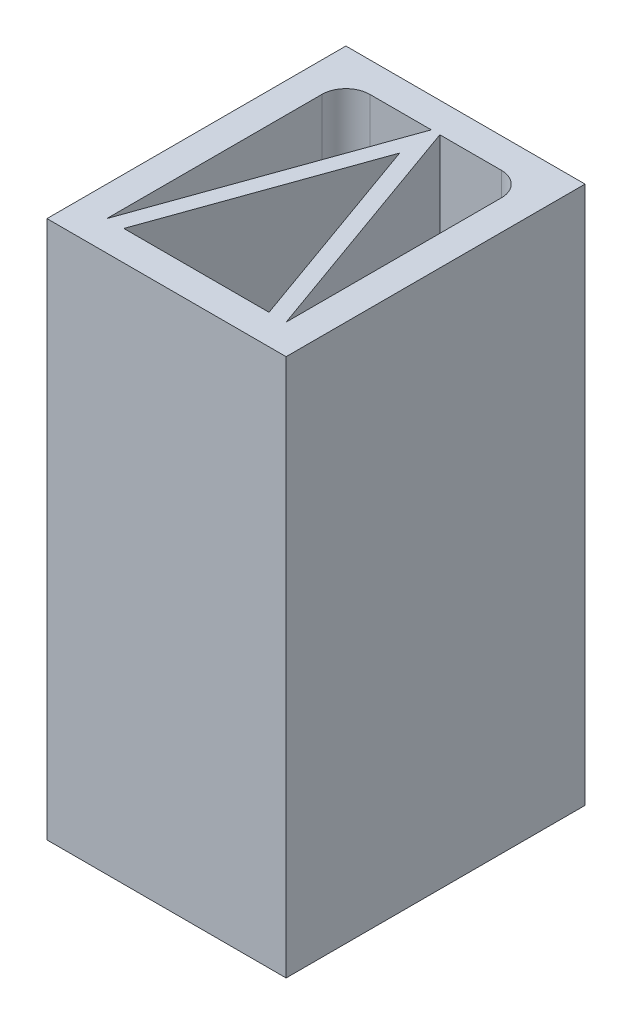
ISO-10303-21;
HEADER;
FILE_DESCRIPTION(('STEP AP214'),'2;1');
FILE_NAME('part.step','',(''),(''),'','','');
FILE_SCHEMA(('AUTOMOTIVE_DESIGN { 1 0 10303 214 1 1 1 1 }'));
ENDSEC;
DATA;
#1=APPLICATION_CONTEXT('core data for automotive mechanical design processes');
#2=APPLICATION_PROTOCOL_DEFINITION('international standard','automotive_design',2000,#1);
#3=PRODUCT_CONTEXT('',#1,'mechanical');
#4=PRODUCT('Part','Part','',(#3));
#5=PRODUCT_RELATED_PRODUCT_CATEGORY('part','',(#4));
#6=PRODUCT_DEFINITION_FORMATION('','',#4);
#7=PRODUCT_DEFINITION_CONTEXT('part definition',#1,'design');
#8=PRODUCT_DEFINITION('design','',#6,#7);
#9=PRODUCT_DEFINITION_SHAPE('','',#8);
#10=(LENGTH_UNIT() NAMED_UNIT(*) SI_UNIT(.MILLI.,.METRE.));
#11=(NAMED_UNIT(*) PLANE_ANGLE_UNIT() SI_UNIT($,.RADIAN.));
#12=(NAMED_UNIT(*) SI_UNIT($,.STERADIAN.) SOLID_ANGLE_UNIT());
#13=UNCERTAINTY_MEASURE_WITH_UNIT(LENGTH_MEASURE(1.E-05),#10,'distance_accuracy_value','');
#14=(GEOMETRIC_REPRESENTATION_CONTEXT(3) GLOBAL_UNCERTAINTY_ASSIGNED_CONTEXT((#13)) GLOBAL_UNIT_ASSIGNED_CONTEXT((#10,
#11,#12)) REPRESENTATION_CONTEXT('',''));
#15=CARTESIAN_POINT('',(0.,0.,0.));
#16=DIRECTION('',(0.,0.,1.));
#17=DIRECTION('',(1.,0.,0.));
#18=AXIS2_PLACEMENT_3D('',#15,#16,#17);
#19=CARTESIAN_POINT('',(2.5,45.,-22.5));
#20=DIRECTION('',(0.,0.,1.));
#21=DIRECTION('',(1.,0.,0.));
#22=AXIS2_PLACEMENT_3D('',#19,#20,#21);
#23=PLANE('',#22);
#24=DIRECTION('',(-1.,0.,0.));
#25=VECTOR('',#24,1.);
#26=CARTESIAN_POINT('',(2.5,0.,-22.5));
#27=LINE('',#26,#25);
#28=CARTESIAN_POINT('',(15.5,0.,-22.5));
#29=VERTEX_POINT('',#28);
#30=CARTESIAN_POINT('',(10.3571428571429,0.,-22.5));
#31=VERTEX_POINT('',#30);
#32=EDGE_CURVE('E202',#29,#31,#27,.T.);
#33=ORIENTED_EDGE('',*,*,#32,.F.);
#34=DIRECTION('',(0.,-1.,0.));
#35=VECTOR('',#34,1.);
#36=CARTESIAN_POINT('',(15.5,45.,-22.5));
#37=LINE('',#36,#35);
#38=CARTESIAN_POINT('',(15.5,45.,-22.5));
#39=VERTEX_POINT('',#38);
#40=EDGE_CURVE('E57',#29,#39,#37,.F.);
#41=ORIENTED_EDGE('',*,*,#40,.T.);
#42=DIRECTION('',(-1.,0.,0.));
#43=VECTOR('',#42,1.);
#44=CARTESIAN_POINT('',(2.5,45.,-22.5));
#45=LINE('',#44,#43);
#46=CARTESIAN_POINT('',(10.3571428571429,45.,-22.5));
#47=VERTEX_POINT('',#46);
#48=EDGE_CURVE('E210',#39,#47,#45,.T.);
#49=ORIENTED_EDGE('',*,*,#48,.T.);
#50=DIRECTION('',(0.,1.,0.));
#51=VECTOR('',#50,1.);
#52=CARTESIAN_POINT('',(10.3571428571429,45.,-22.5));
#53=LINE('',#52,#51);
#54=EDGE_CURVE('E279',#31,#47,#53,.T.);
#55=ORIENTED_EDGE('',*,*,#54,.F.);
#56=EDGE_LOOP('',(#33,#41,#49,#55));
#57=FACE_BOUND('',#56,.T.);
#58=ADVANCED_FACE('F41',(#57),#23,.T.);
#59=CARTESIAN_POINT('',(0.,45.,0.));
#60=DIRECTION('',(0.,-1.,0.));
#61=DIRECTION('',(0.,0.,-1.));
#62=AXIS2_PLACEMENT_3D('',#59,#60,#61);
#63=PLANE('',#62);
#64=DIRECTION('',(0.336336396998156,0.,0.941741911594837));
#65=VECTOR('',#64,1.);
#66=CARTESIAN_POINT('',(17.5,45.,-2.5));
#67=LINE('',#66,#65);
#68=CARTESIAN_POINT('',(17.5,45.,-2.5));
#69=VERTEX_POINT('',#68);
#70=EDGE_CURVE('E183',#47,#69,#67,.T.);
#71=ORIENTED_EDGE('',*,*,#70,.F.);
#72=ORIENTED_EDGE('',*,*,#48,.F.);
#73=CARTESIAN_POINT('',(15.5,45.,-20.5));
#74=DIRECTION('',(0.,-1.,0.));
#75=DIRECTION('',(0.,0.,-1.));
#76=AXIS2_PLACEMENT_3D('',#73,#74,#75);
#77=CIRCLE('',#76,2.);
#78=CARTESIAN_POINT('',(17.5,45.,-20.5));
#79=VERTEX_POINT('',#78);
#80=EDGE_CURVE('E11',#39,#79,#77,.T.);
#81=ORIENTED_EDGE('',*,*,#80,.T.);
#82=DIRECTION('',(0.,0.,-1.));
#83=VECTOR('',#82,1.);
#84=CARTESIAN_POINT('',(17.5,45.,-22.5));
#85=LINE('',#84,#83);
#86=EDGE_CURVE('E205',#69,#79,#85,.T.);
#87=ORIENTED_EDGE('',*,*,#86,.F.);
#88=EDGE_LOOP('',(#71,#72,#81,#87));
#89=FACE_BOUND('',#88,.T.);
#90=DIRECTION('',(-0.336336396998156,0.,-0.941741911594838));
#91=VECTOR('',#90,1.);
#92=CARTESIAN_POINT('',(16.0714285714286,45.,-2.5));
#93=LINE('',#92,#91);
#94=CARTESIAN_POINT('',(16.0714285714286,45.,-2.5));
#95=VERTEX_POINT('',#94);
#96=CARTESIAN_POINT('',(10.,45.,-19.5));
#97=VERTEX_POINT('',#96);
#98=EDGE_CURVE('E166',#95,#97,#93,.T.);
#99=ORIENTED_EDGE('',*,*,#98,.F.);
#100=DIRECTION('',(1.,0.,0.));
#101=VECTOR('',#100,1.);
#102=CARTESIAN_POINT('',(2.5,45.,-2.5));
#103=LINE('',#102,#101);
#104=CARTESIAN_POINT('',(3.92857142857143,45.,-2.5));
#105=VERTEX_POINT('',#104);
#106=EDGE_CURVE('E167',#105,#95,#103,.T.);
#107=ORIENTED_EDGE('',*,*,#106,.F.);
#108=DIRECTION('',(-0.336336396998156,0.,0.941741911594838));
#109=VECTOR('',#108,1.);
#110=CARTESIAN_POINT('',(10.,45.,-19.5));
#111=LINE('',#110,#109);
#112=EDGE_CURVE('E150',#97,#105,#111,.T.);
#113=ORIENTED_EDGE('',*,*,#112,.F.);
#114=EDGE_LOOP('',(#99,#107,#113));
#115=FACE_BOUND('',#114,.T.);
#116=DIRECTION('',(0.,0.,1.));
#117=VECTOR('',#116,1.);
#118=CARTESIAN_POINT('',(0.,45.,0.));
#119=LINE('',#118,#117);
#120=CARTESIAN_POINT('',(0.,45.,-25.));
#121=VERTEX_POINT('',#120);
#122=CARTESIAN_POINT('',(0.,45.,0.));
#123=VERTEX_POINT('',#122);
#124=EDGE_CURVE('E234',#121,#123,#119,.T.);
#125=ORIENTED_EDGE('',*,*,#124,.T.);
#126=DIRECTION('',(1.,0.,0.));
#127=VECTOR('',#126,1.);
#128=CARTESIAN_POINT('',(0.,45.,0.));
#129=LINE('',#128,#127);
#130=CARTESIAN_POINT('',(20.,45.,0.));
#131=VERTEX_POINT('',#130);
#132=EDGE_CURVE('E238',#123,#131,#129,.T.);
#133=ORIENTED_EDGE('',*,*,#132,.T.);
#134=DIRECTION('',(0.,0.,-1.));
#135=VECTOR('',#134,1.);
#136=CARTESIAN_POINT('',(20.,45.,0.));
#137=LINE('',#136,#135);
#138=CARTESIAN_POINT('',(20.,45.,-25.));
#139=VERTEX_POINT('',#138);
#140=EDGE_CURVE('E242',#131,#139,#137,.T.);
#141=ORIENTED_EDGE('',*,*,#140,.T.);
#142=DIRECTION('',(-1.,0.,0.));
#143=VECTOR('',#142,1.);
#144=CARTESIAN_POINT('',(0.,45.,-25.));
#145=LINE('',#144,#143);
#146=EDGE_CURVE('E245',#139,#121,#145,.T.);
#147=ORIENTED_EDGE('',*,*,#146,.T.);
#148=EDGE_LOOP('',(#125,#133,#141,#147));
#149=FACE_BOUND('',#148,.T.);
#150=CARTESIAN_POINT('',(9.64285714285714,45.,-22.5));
#151=VERTEX_POINT('',#150);
#152=CARTESIAN_POINT('',(4.5,45.,-22.5));
#153=VERTEX_POINT('',#152);
#154=EDGE_CURVE('E209',#151,#153,#45,.T.);
#155=ORIENTED_EDGE('',*,*,#154,.F.);
#156=DIRECTION('',(0.336336396998156,0.,-0.941741911594838));
#157=VECTOR('',#156,1.);
#158=CARTESIAN_POINT('',(10.,45.,-23.5));
#159=LINE('',#158,#157);
#160=CARTESIAN_POINT('',(2.5,45.,-2.5));
#161=VERTEX_POINT('',#160);
#162=EDGE_CURVE('E169',#161,#151,#159,.T.);
#163=ORIENTED_EDGE('',*,*,#162,.F.);
#164=DIRECTION('',(0.,0.,1.));
#165=VECTOR('',#164,1.);
#166=CARTESIAN_POINT('',(2.5,45.,-22.5));
#167=LINE('',#166,#165);
#168=CARTESIAN_POINT('',(2.5,45.,-20.5));
#169=VERTEX_POINT('',#168);
#170=EDGE_CURVE('E199',#169,#161,#167,.T.);
#171=ORIENTED_EDGE('',*,*,#170,.F.);
#172=CARTESIAN_POINT('',(4.5,45.,-20.5));
#173=DIRECTION('',(0.,-1.,0.));
#174=DIRECTION('',(0.,0.,-1.));
#175=AXIS2_PLACEMENT_3D('',#172,#173,#174);
#176=CIRCLE('',#175,2.);
#177=EDGE_CURVE('E299',#169,#153,#176,.T.);
#178=ORIENTED_EDGE('',*,*,#177,.T.);
#179=EDGE_LOOP('',(#155,#163,#171,#178));
#180=FACE_BOUND('',#179,.T.);
#181=ADVANCED_FACE('F164',(#89,#115,#149,#180),#63,.F.);
#182=CARTESIAN_POINT('',(0.,0.,0.));
#183=DIRECTION('',(0.,-1.,0.));
#184=DIRECTION('',(0.,0.,-1.));
#185=AXIS2_PLACEMENT_3D('',#182,#183,#184);
#186=PLANE('',#185);
#187=DIRECTION('',(0.,0.,-1.));
#188=VECTOR('',#187,1.);
#189=CARTESIAN_POINT('',(17.5,0.,-22.5));
#190=LINE('',#189,#188);
#191=CARTESIAN_POINT('',(17.5,0.,-2.5));
#192=VERTEX_POINT('',#191);
#193=CARTESIAN_POINT('',(17.5,0.,-20.5));
#194=VERTEX_POINT('',#193);
#195=EDGE_CURVE('E220',#192,#194,#190,.T.);
#196=ORIENTED_EDGE('',*,*,#195,.T.);
#197=CARTESIAN_POINT('',(15.5,0.,-20.5));
#198=DIRECTION('',(0.,-1.,0.));
#199=DIRECTION('',(0.,0.,-1.));
#200=AXIS2_PLACEMENT_3D('',#197,#198,#199);
#201=CIRCLE('',#200,2.);
#202=EDGE_CURVE('E50',#194,#29,#201,.F.);
#203=ORIENTED_EDGE('',*,*,#202,.T.);
#204=ORIENTED_EDGE('',*,*,#32,.T.);
#205=DIRECTION('',(0.336336396998156,0.,0.941741911594837));
#206=VECTOR('',#205,1.);
#207=CARTESIAN_POINT('',(17.5,0.,-2.5));
#208=LINE('',#207,#206);
#209=EDGE_CURVE('E174',#31,#192,#208,.T.);
#210=ORIENTED_EDGE('',*,*,#209,.T.);
#211=EDGE_LOOP('',(#196,#203,#204,#210));
#212=FACE_BOUND('',#211,.T.);
#213=DIRECTION('',(1.,0.,0.));
#214=VECTOR('',#213,1.);
#215=CARTESIAN_POINT('',(2.5,0.,-2.5));
#216=LINE('',#215,#214);
#217=CARTESIAN_POINT('',(3.92857142857143,0.,-2.5));
#218=VERTEX_POINT('',#217);
#219=CARTESIAN_POINT('',(16.0714285714286,0.,-2.5));
#220=VERTEX_POINT('',#219);
#221=EDGE_CURVE('E216',#218,#220,#216,.T.);
#222=ORIENTED_EDGE('',*,*,#221,.T.);
#223=DIRECTION('',(-0.336336396998156,0.,-0.941741911594838));
#224=VECTOR('',#223,1.);
#225=CARTESIAN_POINT('',(16.0714285714286,0.,-2.5));
#226=LINE('',#225,#224);
#227=CARTESIAN_POINT('',(10.,0.,-19.5));
#228=VERTEX_POINT('',#227);
#229=EDGE_CURVE('E187',#220,#228,#226,.T.);
#230=ORIENTED_EDGE('',*,*,#229,.T.);
#231=DIRECTION('',(-0.336336396998156,0.,0.941741911594838));
#232=VECTOR('',#231,1.);
#233=CARTESIAN_POINT('',(10.,0.,-19.5));
#234=LINE('',#233,#232);
#235=EDGE_CURVE('E152',#228,#218,#234,.T.);
#236=ORIENTED_EDGE('',*,*,#235,.T.);
#237=EDGE_LOOP('',(#222,#230,#236));
#238=FACE_BOUND('',#237,.T.);
#239=DIRECTION('',(0.336336396998156,0.,-0.941741911594838));
#240=VECTOR('',#239,1.);
#241=CARTESIAN_POINT('',(10.,0.,-23.5));
#242=LINE('',#241,#240);
#243=CARTESIAN_POINT('',(2.5,0.,-2.5));
#244=VERTEX_POINT('',#243);
#245=CARTESIAN_POINT('',(9.64285714285714,0.,-22.5));
#246=VERTEX_POINT('',#245);
#247=EDGE_CURVE('E178',#244,#246,#242,.T.);
#248=ORIENTED_EDGE('',*,*,#247,.T.);
#249=CARTESIAN_POINT('',(4.5,0.,-22.5));
#250=VERTEX_POINT('',#249);
#251=EDGE_CURVE('E223',#246,#250,#27,.T.);
#252=ORIENTED_EDGE('',*,*,#251,.T.);
#253=CARTESIAN_POINT('',(4.5,0.,-20.5));
#254=DIRECTION('',(0.,-1.,0.));
#255=DIRECTION('',(0.,0.,-1.));
#256=AXIS2_PLACEMENT_3D('',#253,#254,#255);
#257=CIRCLE('',#256,2.);
#258=CARTESIAN_POINT('',(2.5,0.,-20.5));
#259=VERTEX_POINT('',#258);
#260=EDGE_CURVE('E296',#250,#259,#257,.F.);
#261=ORIENTED_EDGE('',*,*,#260,.T.);
#262=DIRECTION('',(0.,0.,1.));
#263=VECTOR('',#262,1.);
#264=CARTESIAN_POINT('',(2.5,0.,-22.5));
#265=LINE('',#264,#263);
#266=EDGE_CURVE('E195',#259,#244,#265,.T.);
#267=ORIENTED_EDGE('',*,*,#266,.T.);
#268=EDGE_LOOP('',(#248,#252,#261,#267));
#269=FACE_BOUND('',#268,.T.);
#270=DIRECTION('',(0.,0.,1.));
#271=VECTOR('',#270,1.);
#272=CARTESIAN_POINT('',(0.,0.,0.));
#273=LINE('',#272,#271);
#274=CARTESIAN_POINT('',(0.,0.,-25.));
#275=VERTEX_POINT('',#274);
#276=CARTESIAN_POINT('',(0.,0.,0.));
#277=VERTEX_POINT('',#276);
#278=EDGE_CURVE('E233',#275,#277,#273,.T.);
#279=ORIENTED_EDGE('',*,*,#278,.F.);
#280=DIRECTION('',(-1.,0.,0.));
#281=VECTOR('',#280,1.);
#282=CARTESIAN_POINT('',(0.,0.,-25.));
#283=LINE('',#282,#281);
#284=CARTESIAN_POINT('',(20.,0.,-25.));
#285=VERTEX_POINT('',#284);
#286=EDGE_CURVE('E239',#285,#275,#283,.T.);
#287=ORIENTED_EDGE('',*,*,#286,.F.);
#288=DIRECTION('',(0.,0.,-1.));
#289=VECTOR('',#288,1.);
#290=CARTESIAN_POINT('',(20.,0.,0.));
#291=LINE('',#290,#289);
#292=CARTESIAN_POINT('',(20.,0.,0.));
#293=VERTEX_POINT('',#292);
#294=EDGE_CURVE('E255',#293,#285,#291,.T.);
#295=ORIENTED_EDGE('',*,*,#294,.F.);
#296=DIRECTION('',(1.,0.,0.));
#297=VECTOR('',#296,1.);
#298=CARTESIAN_POINT('',(0.,0.,0.));
#299=LINE('',#298,#297);
#300=EDGE_CURVE('E252',#277,#293,#299,.T.);
#301=ORIENTED_EDGE('',*,*,#300,.F.);
#302=EDGE_LOOP('',(#279,#287,#295,#301));
#303=FACE_BOUND('',#302,.T.);
#304=ADVANCED_FACE('F308',(#212,#238,#269,#303),#186,.T.);
#305=CARTESIAN_POINT('',(0.,45.,0.));
#306=DIRECTION('',(1.,0.,0.));
#307=DIRECTION('',(0.,0.,-1.));
#308=AXIS2_PLACEMENT_3D('',#305,#306,#307);
#309=PLANE('',#308);
#310=ORIENTED_EDGE('',*,*,#278,.T.);
#311=DIRECTION('',(0.,-1.,0.));
#312=VECTOR('',#311,1.);
#313=CARTESIAN_POINT('',(0.,45.,0.));
#314=LINE('',#313,#312);
#315=EDGE_CURVE('E271',#123,#277,#314,.T.);
#316=ORIENTED_EDGE('',*,*,#315,.F.);
#317=ORIENTED_EDGE('',*,*,#124,.F.);
#318=DIRECTION('',(0.,-1.,0.));
#319=VECTOR('',#318,1.);
#320=CARTESIAN_POINT('',(0.,45.,-25.));
#321=LINE('',#320,#319);
#322=EDGE_CURVE('E248',#121,#275,#321,.T.);
#323=ORIENTED_EDGE('',*,*,#322,.T.);
#324=EDGE_LOOP('',(#310,#316,#317,#323));
#325=FACE_BOUND('',#324,.T.);
#326=ADVANCED_FACE('F366',(#325),#309,.F.);
#327=CARTESIAN_POINT('',(0.,45.,0.));
#328=DIRECTION('',(0.,0.,-1.));
#329=DIRECTION('',(-1.,0.,0.));
#330=AXIS2_PLACEMENT_3D('',#327,#328,#329);
#331=PLANE('',#330);
#332=ORIENTED_EDGE('',*,*,#300,.T.);
#333=DIRECTION('',(0.,-1.,0.));
#334=VECTOR('',#333,1.);
#335=CARTESIAN_POINT('',(20.,45.,0.));
#336=LINE('',#335,#334);
#337=EDGE_CURVE('E267',#131,#293,#336,.T.);
#338=ORIENTED_EDGE('',*,*,#337,.F.);
#339=ORIENTED_EDGE('',*,*,#132,.F.);
#340=ORIENTED_EDGE('',*,*,#315,.T.);
#341=EDGE_LOOP('',(#332,#338,#339,#340));
#342=FACE_BOUND('',#341,.T.);
#343=ADVANCED_FACE('F373',(#342),#331,.F.);
#344=CARTESIAN_POINT('',(20.,45.,0.));
#345=DIRECTION('',(-1.,0.,0.));
#346=DIRECTION('',(0.,0.,1.));
#347=AXIS2_PLACEMENT_3D('',#344,#345,#346);
#348=PLANE('',#347);
#349=ORIENTED_EDGE('',*,*,#294,.T.);
#350=DIRECTION('',(0.,-1.,0.));
#351=VECTOR('',#350,1.);
#352=CARTESIAN_POINT('',(20.,45.,-25.));
#353=LINE('',#352,#351);
#354=EDGE_CURVE('E263',#139,#285,#353,.T.);
#355=ORIENTED_EDGE('',*,*,#354,.F.);
#356=ORIENTED_EDGE('',*,*,#140,.F.);
#357=ORIENTED_EDGE('',*,*,#337,.T.);
#358=EDGE_LOOP('',(#349,#355,#356,#357));
#359=FACE_BOUND('',#358,.T.);
#360=ADVANCED_FACE('F369',(#359),#348,.F.);
#361=CARTESIAN_POINT('',(0.,45.,-25.));
#362=DIRECTION('',(0.,0.,1.));
#363=DIRECTION('',(1.,0.,0.));
#364=AXIS2_PLACEMENT_3D('',#361,#362,#363);
#365=PLANE('',#364);
#366=ORIENTED_EDGE('',*,*,#286,.T.);
#367=ORIENTED_EDGE('',*,*,#322,.F.);
#368=ORIENTED_EDGE('',*,*,#146,.F.);
#369=ORIENTED_EDGE('',*,*,#354,.T.);
#370=EDGE_LOOP('',(#366,#367,#368,#369));
#371=FACE_BOUND('',#370,.T.);
#372=ADVANCED_FACE('F362',(#371),#365,.F.);
#373=CARTESIAN_POINT('',(2.5,45.,-22.5));
#374=DIRECTION('',(1.,0.,0.));
#375=DIRECTION('',(0.,0.,-1.));
#376=AXIS2_PLACEMENT_3D('',#373,#374,#375);
#377=PLANE('',#376);
#378=ORIENTED_EDGE('',*,*,#266,.F.);
#379=DIRECTION('',(0.,-1.,0.));
#380=VECTOR('',#379,1.);
#381=CARTESIAN_POINT('',(2.5,45.,-20.5));
#382=LINE('',#381,#380);
#383=EDGE_CURVE('E287',#259,#169,#382,.F.);
#384=ORIENTED_EDGE('',*,*,#383,.T.);
#385=ORIENTED_EDGE('',*,*,#170,.T.);
#386=DIRECTION('',(0.,-1.,0.));
#387=VECTOR('',#386,1.);
#388=CARTESIAN_POINT('',(2.5,45.,-2.5));
#389=LINE('',#388,#387);
#390=EDGE_CURVE('E229',#161,#244,#389,.T.);
#391=ORIENTED_EDGE('',*,*,#390,.T.);
#392=EDGE_LOOP('',(#378,#384,#385,#391));
#393=FACE_BOUND('',#392,.T.);
#394=ADVANCED_FACE('F323',(#393),#377,.T.);
#395=CARTESIAN_POINT('',(2.5,45.,-2.5));
#396=DIRECTION('',(0.,0.,-1.));
#397=DIRECTION('',(-1.,0.,0.));
#398=AXIS2_PLACEMENT_3D('',#395,#396,#397);
#399=PLANE('',#398);
#400=DIRECTION('',(0.,-1.,0.));
#401=VECTOR('',#400,1.);
#402=CARTESIAN_POINT('',(3.92857142857143,45.,-2.5));
#403=LINE('',#402,#401);
#404=EDGE_CURVE('E158',#105,#218,#403,.T.);
#405=ORIENTED_EDGE('',*,*,#404,.F.);
#406=ORIENTED_EDGE('',*,*,#106,.T.);
#407=DIRECTION('',(0.,-1.,0.));
#408=VECTOR('',#407,1.);
#409=CARTESIAN_POINT('',(16.0714285714286,45.,-2.5));
#410=LINE('',#409,#408);
#411=EDGE_CURVE('E159',#95,#220,#410,.T.);
#412=ORIENTED_EDGE('',*,*,#411,.T.);
#413=ORIENTED_EDGE('',*,*,#221,.F.);
#414=EDGE_LOOP('',(#405,#406,#412,#413));
#415=FACE_BOUND('',#414,.T.);
#416=ADVANCED_FACE('F353',(#415),#399,.T.);
#417=CARTESIAN_POINT('',(17.5,45.,-22.5));
#418=DIRECTION('',(-1.,0.,0.));
#419=DIRECTION('',(0.,0.,1.));
#420=AXIS2_PLACEMENT_3D('',#417,#418,#419);
#421=PLANE('',#420);
#422=ORIENTED_EDGE('',*,*,#86,.T.);
#423=DIRECTION('',(0.,-1.,0.));
#424=VECTOR('',#423,1.);
#425=CARTESIAN_POINT('',(17.5,0.,-20.5));
#426=LINE('',#425,#424);
#427=EDGE_CURVE('E290',#79,#194,#426,.T.);
#428=ORIENTED_EDGE('',*,*,#427,.T.);
#429=ORIENTED_EDGE('',*,*,#195,.F.);
#430=DIRECTION('',(0.,-1.,0.));
#431=VECTOR('',#430,1.);
#432=CARTESIAN_POINT('',(17.5,45.,-2.5));
#433=LINE('',#432,#431);
#434=EDGE_CURVE('E213',#69,#192,#433,.T.);
#435=ORIENTED_EDGE('',*,*,#434,.F.);
#436=EDGE_LOOP('',(#422,#428,#429,#435));
#437=FACE_BOUND('',#436,.T.);
#438=ADVANCED_FACE('F349',(#437),#421,.T.);
#439=ORIENTED_EDGE('',*,*,#154,.T.);
#440=DIRECTION('',(0.,-1.,0.));
#441=VECTOR('',#440,1.);
#442=CARTESIAN_POINT('',(4.5,0.,-22.5));
#443=LINE('',#442,#441);
#444=EDGE_CURVE('E283',#153,#250,#443,.T.);
#445=ORIENTED_EDGE('',*,*,#444,.T.);
#446=ORIENTED_EDGE('',*,*,#251,.F.);
#447=DIRECTION('',(0.,-1.,0.));
#448=VECTOR('',#447,1.);
#449=CARTESIAN_POINT('',(9.64285714285714,45.,-22.5));
#450=LINE('',#449,#448);
#451=EDGE_CURVE('E275',#151,#246,#450,.T.);
#452=ORIENTED_EDGE('',*,*,#451,.F.);
#453=EDGE_LOOP('',(#439,#445,#446,#452));
#454=FACE_BOUND('',#453,.T.);
#455=ADVANCED_FACE('F314',(#454),#23,.T.);
#456=CARTESIAN_POINT('',(17.5,45.,-2.5));
#457=DIRECTION('',(0.941741911594837,0.,-0.336336396998156));
#458=DIRECTION('',(-0.336336396998156,0.,-0.941741911594837));
#459=AXIS2_PLACEMENT_3D('',#456,#457,#458);
#460=PLANE('',#459);
#461=ORIENTED_EDGE('',*,*,#209,.F.);
#462=ORIENTED_EDGE('',*,*,#54,.T.);
#463=ORIENTED_EDGE('',*,*,#70,.T.);
#464=ORIENTED_EDGE('',*,*,#434,.T.);
#465=EDGE_LOOP('',(#461,#462,#463,#464));
#466=FACE_BOUND('',#465,.T.);
#467=ADVANCED_FACE('F330',(#466),#460,.T.);
#468=CARTESIAN_POINT('',(10.,45.,-23.5));
#469=DIRECTION('',(-0.941741911594837,0.,-0.336336396998156));
#470=DIRECTION('',(-0.336336396998156,0.,0.941741911594838));
#471=AXIS2_PLACEMENT_3D('',#468,#469,#470);
#472=PLANE('',#471);
#473=ORIENTED_EDGE('',*,*,#162,.T.);
#474=ORIENTED_EDGE('',*,*,#451,.T.);
#475=ORIENTED_EDGE('',*,*,#247,.F.);
#476=ORIENTED_EDGE('',*,*,#390,.F.);
#477=EDGE_LOOP('',(#473,#474,#475,#476));
#478=FACE_BOUND('',#477,.T.);
#479=ADVANCED_FACE('F328',(#478),#472,.T.);
#480=CARTESIAN_POINT('',(10.,45.,-19.5));
#481=DIRECTION('',(0.941741911594838,0.,0.336336396998156));
#482=DIRECTION('',(0.336336396998156,0.,-0.941741911594838));
#483=AXIS2_PLACEMENT_3D('',#480,#481,#482);
#484=PLANE('',#483);
#485=ORIENTED_EDGE('',*,*,#235,.F.);
#486=DIRECTION('',(0.,-1.,0.));
#487=VECTOR('',#486,1.);
#488=CARTESIAN_POINT('',(10.,45.,-19.5));
#489=LINE('',#488,#487);
#490=EDGE_CURVE('E146',#97,#228,#489,.T.);
#491=ORIENTED_EDGE('',*,*,#490,.F.);
#492=ORIENTED_EDGE('',*,*,#112,.T.);
#493=ORIENTED_EDGE('',*,*,#404,.T.);
#494=EDGE_LOOP('',(#485,#491,#492,#493));
#495=FACE_BOUND('',#494,.T.);
#496=ADVANCED_FACE('F148',(#495),#484,.T.);
#497=CARTESIAN_POINT('',(16.0714285714286,45.,-2.5));
#498=DIRECTION('',(-0.941741911594838,0.,0.336336396998156));
#499=DIRECTION('',(0.336336396998156,0.,0.941741911594838));
#500=AXIS2_PLACEMENT_3D('',#497,#498,#499);
#501=PLANE('',#500);
#502=ORIENTED_EDGE('',*,*,#229,.F.);
#503=ORIENTED_EDGE('',*,*,#411,.F.);
#504=ORIENTED_EDGE('',*,*,#98,.T.);
#505=ORIENTED_EDGE('',*,*,#490,.T.);
#506=EDGE_LOOP('',(#502,#503,#504,#505));
#507=FACE_BOUND('',#506,.T.);
#508=ADVANCED_FACE('F172',(#507),#501,.T.);
#509=CARTESIAN_POINT('',(4.5,45.,-20.5));
#510=DIRECTION('',(0.,1.,0.));
#511=DIRECTION('',(0.,0.,1.));
#512=AXIS2_PLACEMENT_3D('',#509,#510,#511);
#513=CYLINDRICAL_SURFACE('',#512,2.);
#514=ORIENTED_EDGE('',*,*,#177,.F.);
#515=ORIENTED_EDGE('',*,*,#383,.F.);
#516=ORIENTED_EDGE('',*,*,#260,.F.);
#517=ORIENTED_EDGE('',*,*,#444,.F.);
#518=EDGE_LOOP('',(#514,#515,#516,#517));
#519=FACE_BOUND('',#518,.T.);
#520=ADVANCED_FACE('F319',(#519),#513,.F.);
#521=CARTESIAN_POINT('',(15.5,45.,-20.5));
#522=DIRECTION('',(0.,1.,0.));
#523=DIRECTION('',(0.,0.,1.));
#524=AXIS2_PLACEMENT_3D('',#521,#522,#523);
#525=CYLINDRICAL_SURFACE('',#524,2.);
#526=ORIENTED_EDGE('',*,*,#80,.F.);
#527=ORIENTED_EDGE('',*,*,#40,.F.);
#528=ORIENTED_EDGE('',*,*,#202,.F.);
#529=ORIENTED_EDGE('',*,*,#427,.F.);
#530=EDGE_LOOP('',(#526,#527,#528,#529));
#531=FACE_BOUND('',#530,.T.);
#532=ADVANCED_FACE('F43',(#531),#525,.F.);
#533=CLOSED_SHELL('',(#58,#181,#304,#326,#343,#360,#372,#394,#416,#438,#455,#467,#479,#496,#508,
#520,#532));
#534=MANIFOLD_SOLID_BREP('B2',#533);
#535=ADVANCED_BREP_SHAPE_REPRESENTATION('',(#18,#534),#14);
#536=SHAPE_DEFINITION_REPRESENTATION(#9,#535);
ENDSEC;
END-ISO-10303-21;
